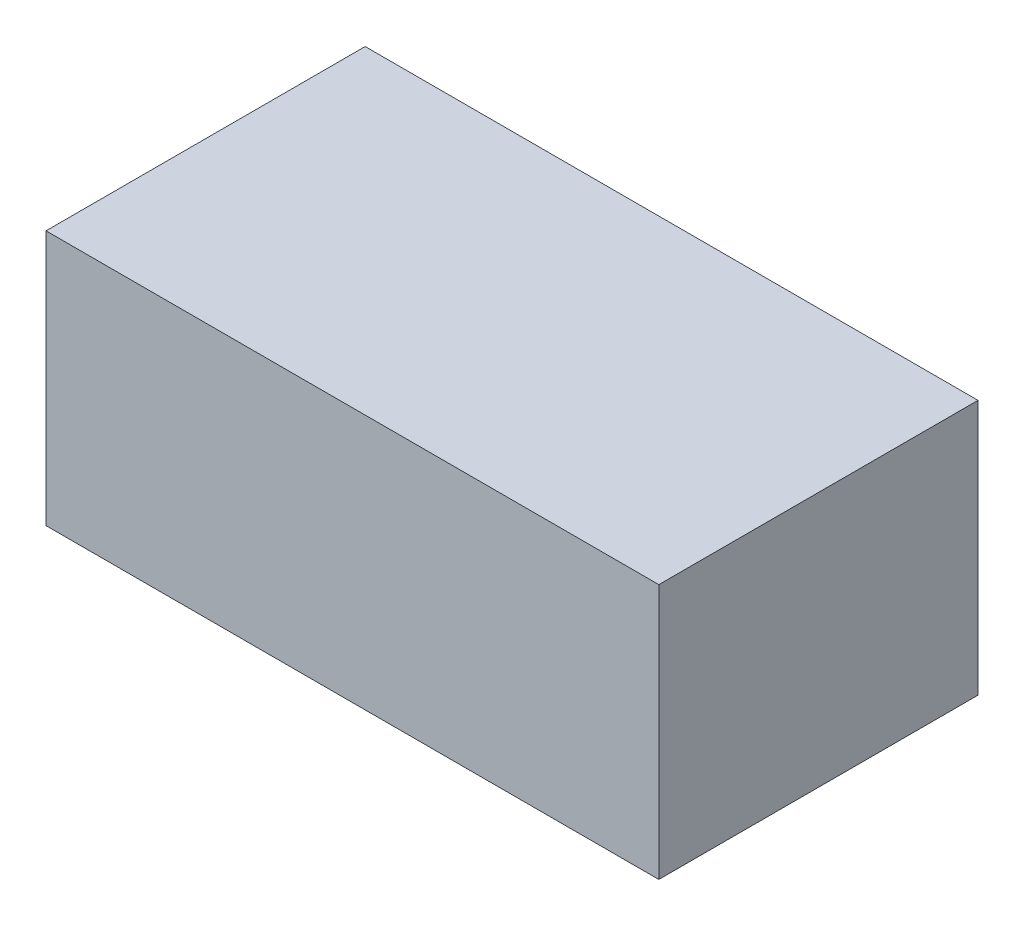
ISO-10303-21;
HEADER;
FILE_DESCRIPTION(('STEP AP214'),'2;1');
FILE_NAME('part.step','',(''),(''),'','','');
FILE_SCHEMA(('AUTOMOTIVE_DESIGN { 1 0 10303 214 1 1 1 1 }'));
ENDSEC;
DATA;
#1=APPLICATION_CONTEXT('core data for automotive mechanical design processes');
#2=APPLICATION_PROTOCOL_DEFINITION('international standard','automotive_design',2000,#1);
#3=PRODUCT_CONTEXT('',#1,'mechanical');
#4=PRODUCT('Part','Part','',(#3));
#5=PRODUCT_RELATED_PRODUCT_CATEGORY('part','',(#4));
#6=PRODUCT_DEFINITION_FORMATION('','',#4);
#7=PRODUCT_DEFINITION_CONTEXT('part definition',#1,'design');
#8=PRODUCT_DEFINITION('design','',#6,#7);
#9=PRODUCT_DEFINITION_SHAPE('','',#8);
#10=(LENGTH_UNIT() NAMED_UNIT(*) SI_UNIT(.MILLI.,.METRE.));
#11=(NAMED_UNIT(*) PLANE_ANGLE_UNIT() SI_UNIT($,.RADIAN.));
#12=(NAMED_UNIT(*) SI_UNIT($,.STERADIAN.) SOLID_ANGLE_UNIT());
#13=UNCERTAINTY_MEASURE_WITH_UNIT(LENGTH_MEASURE(1.E-05),#10,'distance_accuracy_value','');
#14=(GEOMETRIC_REPRESENTATION_CONTEXT(3) GLOBAL_UNCERTAINTY_ASSIGNED_CONTEXT((#13)) GLOBAL_UNIT_ASSIGNED_CONTEXT((#10,
#11,#12)) REPRESENTATION_CONTEXT('',''));
#15=CARTESIAN_POINT('',(0.,0.,0.));
#16=DIRECTION('',(0.,0.,1.));
#17=DIRECTION('',(1.,0.,0.));
#18=AXIS2_PLACEMENT_3D('',#15,#16,#17);
#19=CARTESIAN_POINT('',(24.,20.,-12.5));
#20=DIRECTION('',(-1.,0.,0.));
#21=DIRECTION('',(0.,0.,1.));
#22=AXIS2_PLACEMENT_3D('',#19,#20,#21);
#23=PLANE('',#22);
#24=DIRECTION('',(0.,0.,-1.));
#25=VECTOR('',#24,1.);
#26=CARTESIAN_POINT('',(24.,0.,-12.5));
#27=LINE('',#26,#25);
#28=CARTESIAN_POINT('',(24.,0.,12.5));
#29=VERTEX_POINT('',#28);
#30=CARTESIAN_POINT('',(24.,0.,-12.5));
#31=VERTEX_POINT('',#30);
#32=EDGE_CURVE('E104',#29,#31,#27,.T.);
#33=ORIENTED_EDGE('',*,*,#32,.T.);
#34=DIRECTION('',(0.,-1.,0.));
#35=VECTOR('',#34,1.);
#36=CARTESIAN_POINT('',(24.,20.,-12.5));
#37=LINE('',#36,#35);
#38=CARTESIAN_POINT('',(24.,20.,-12.5));
#39=VERTEX_POINT('',#38);
#40=EDGE_CURVE('E11',#39,#31,#37,.T.);
#41=ORIENTED_EDGE('',*,*,#40,.F.);
#42=DIRECTION('',(0.,0.,-1.));
#43=VECTOR('',#42,1.);
#44=CARTESIAN_POINT('',(24.,20.,-12.5));
#45=LINE('',#44,#43);
#46=CARTESIAN_POINT('',(24.,20.,12.5));
#47=VERTEX_POINT('',#46);
#48=EDGE_CURVE('E92',#47,#39,#45,.T.);
#49=ORIENTED_EDGE('',*,*,#48,.F.);
#50=DIRECTION('',(0.,-1.,0.));
#51=VECTOR('',#50,1.);
#52=CARTESIAN_POINT('',(24.,20.,12.5));
#53=LINE('',#52,#51);
#54=EDGE_CURVE('E100',#47,#29,#53,.T.);
#55=ORIENTED_EDGE('',*,*,#54,.T.);
#56=EDGE_LOOP('',(#33,#41,#49,#55));
#57=FACE_BOUND('',#56,.T.);
#58=ADVANCED_FACE('F41',(#57),#23,.F.);
#59=CARTESIAN_POINT('',(-24.,20.,-12.5));
#60=DIRECTION('',(0.,0.,1.));
#61=DIRECTION('',(1.,0.,0.));
#62=AXIS2_PLACEMENT_3D('',#59,#60,#61);
#63=PLANE('',#62);
#64=DIRECTION('',(-1.,0.,0.));
#65=VECTOR('',#64,1.);
#66=CARTESIAN_POINT('',(-24.,0.,-12.5));
#67=LINE('',#66,#65);
#68=CARTESIAN_POINT('',(-24.,0.,-12.5));
#69=VERTEX_POINT('',#68);
#70=EDGE_CURVE('E96',#31,#69,#67,.T.);
#71=ORIENTED_EDGE('',*,*,#70,.T.);
#72=DIRECTION('',(0.,-1.,0.));
#73=VECTOR('',#72,1.);
#74=CARTESIAN_POINT('',(-24.,20.,-12.5));
#75=LINE('',#74,#73);
#76=CARTESIAN_POINT('',(-24.,20.,-12.5));
#77=VERTEX_POINT('',#76);
#78=EDGE_CURVE('E49',#77,#69,#75,.T.);
#79=ORIENTED_EDGE('',*,*,#78,.F.);
#80=DIRECTION('',(-1.,0.,0.));
#81=VECTOR('',#80,1.);
#82=CARTESIAN_POINT('',(-24.,20.,-12.5));
#83=LINE('',#82,#81);
#84=EDGE_CURVE('E87',#39,#77,#83,.T.);
#85=ORIENTED_EDGE('',*,*,#84,.F.);
#86=ORIENTED_EDGE('',*,*,#40,.T.);
#87=EDGE_LOOP('',(#71,#79,#85,#86));
#88=FACE_BOUND('',#87,.T.);
#89=ADVANCED_FACE('F95',(#88),#63,.F.);
#90=CARTESIAN_POINT('',(-24.,20.,-12.5));
#91=DIRECTION('',(1.,0.,0.));
#92=DIRECTION('',(0.,0.,-1.));
#93=AXIS2_PLACEMENT_3D('',#90,#91,#92);
#94=PLANE('',#93);
#95=DIRECTION('',(0.,0.,1.));
#96=VECTOR('',#95,1.);
#97=CARTESIAN_POINT('',(-24.,0.,-12.5));
#98=LINE('',#97,#96);
#99=CARTESIAN_POINT('',(-24.,0.,12.5));
#100=VERTEX_POINT('',#99);
#101=EDGE_CURVE('E74',#69,#100,#98,.T.);
#102=ORIENTED_EDGE('',*,*,#101,.T.);
#103=DIRECTION('',(0.,-1.,0.));
#104=VECTOR('',#103,1.);
#105=CARTESIAN_POINT('',(-24.,20.,12.5));
#106=LINE('',#105,#104);
#107=CARTESIAN_POINT('',(-24.,20.,12.5));
#108=VERTEX_POINT('',#107);
#109=EDGE_CURVE('E97',#108,#100,#106,.T.);
#110=ORIENTED_EDGE('',*,*,#109,.F.);
#111=DIRECTION('',(0.,0.,1.));
#112=VECTOR('',#111,1.);
#113=CARTESIAN_POINT('',(-24.,20.,-12.5));
#114=LINE('',#113,#112);
#115=EDGE_CURVE('E90',#77,#108,#114,.T.);
#116=ORIENTED_EDGE('',*,*,#115,.F.);
#117=ORIENTED_EDGE('',*,*,#78,.T.);
#118=EDGE_LOOP('',(#102,#110,#116,#117));
#119=FACE_BOUND('',#118,.T.);
#120=ADVANCED_FACE('F98',(#119),#94,.F.);
#121=CARTESIAN_POINT('',(-24.,20.,12.5));
#122=DIRECTION('',(0.,0.,-1.));
#123=DIRECTION('',(-1.,0.,0.));
#124=AXIS2_PLACEMENT_3D('',#121,#122,#123);
#125=PLANE('',#124);
#126=DIRECTION('',(1.,0.,0.));
#127=VECTOR('',#126,1.);
#128=CARTESIAN_POINT('',(-24.,0.,12.5));
#129=LINE('',#128,#127);
#130=EDGE_CURVE('E80',#100,#29,#129,.T.);
#131=ORIENTED_EDGE('',*,*,#130,.T.);
#132=ORIENTED_EDGE('',*,*,#54,.F.);
#133=DIRECTION('',(1.,0.,0.));
#134=VECTOR('',#133,1.);
#135=CARTESIAN_POINT('',(-24.,20.,12.5));
#136=LINE('',#135,#134);
#137=EDGE_CURVE('E57',#108,#47,#136,.T.);
#138=ORIENTED_EDGE('',*,*,#137,.F.);
#139=ORIENTED_EDGE('',*,*,#109,.T.);
#140=EDGE_LOOP('',(#131,#132,#138,#139));
#141=FACE_BOUND('',#140,.T.);
#142=ADVANCED_FACE('F111',(#141),#125,.F.);
#143=CARTESIAN_POINT('',(0.,20.,0.));
#144=DIRECTION('',(0.,1.,0.));
#145=DIRECTION('',(0.,0.,1.));
#146=AXIS2_PLACEMENT_3D('',#143,#144,#145);
#147=PLANE('',#146);
#148=ORIENTED_EDGE('',*,*,#48,.T.);
#149=ORIENTED_EDGE('',*,*,#84,.T.);
#150=ORIENTED_EDGE('',*,*,#115,.T.);
#151=ORIENTED_EDGE('',*,*,#137,.T.);
#152=EDGE_LOOP('',(#148,#149,#150,#151));
#153=FACE_BOUND('',#152,.T.);
#154=ADVANCED_FACE('F88',(#153),#147,.T.);
#155=CARTESIAN_POINT('',(0.,0.,0.));
#156=DIRECTION('',(0.,1.,0.));
#157=DIRECTION('',(0.,0.,1.));
#158=AXIS2_PLACEMENT_3D('',#155,#156,#157);
#159=PLANE('',#158);
#160=ORIENTED_EDGE('',*,*,#32,.F.);
#161=ORIENTED_EDGE('',*,*,#130,.F.);
#162=ORIENTED_EDGE('',*,*,#101,.F.);
#163=ORIENTED_EDGE('',*,*,#70,.F.);
#164=EDGE_LOOP('',(#160,#161,#162,#163));
#165=FACE_BOUND('',#164,.T.);
#166=ADVANCED_FACE('F114',(#165),#159,.F.);
#167=CLOSED_SHELL('',(#58,#89,#120,#142,#154,#166));
#168=MANIFOLD_SOLID_BREP('B2',#167);
#169=ADVANCED_BREP_SHAPE_REPRESENTATION('',(#18,#168),#14);
#170=SHAPE_DEFINITION_REPRESENTATION(#9,#169);
ENDSEC;
END-ISO-10303-21;
